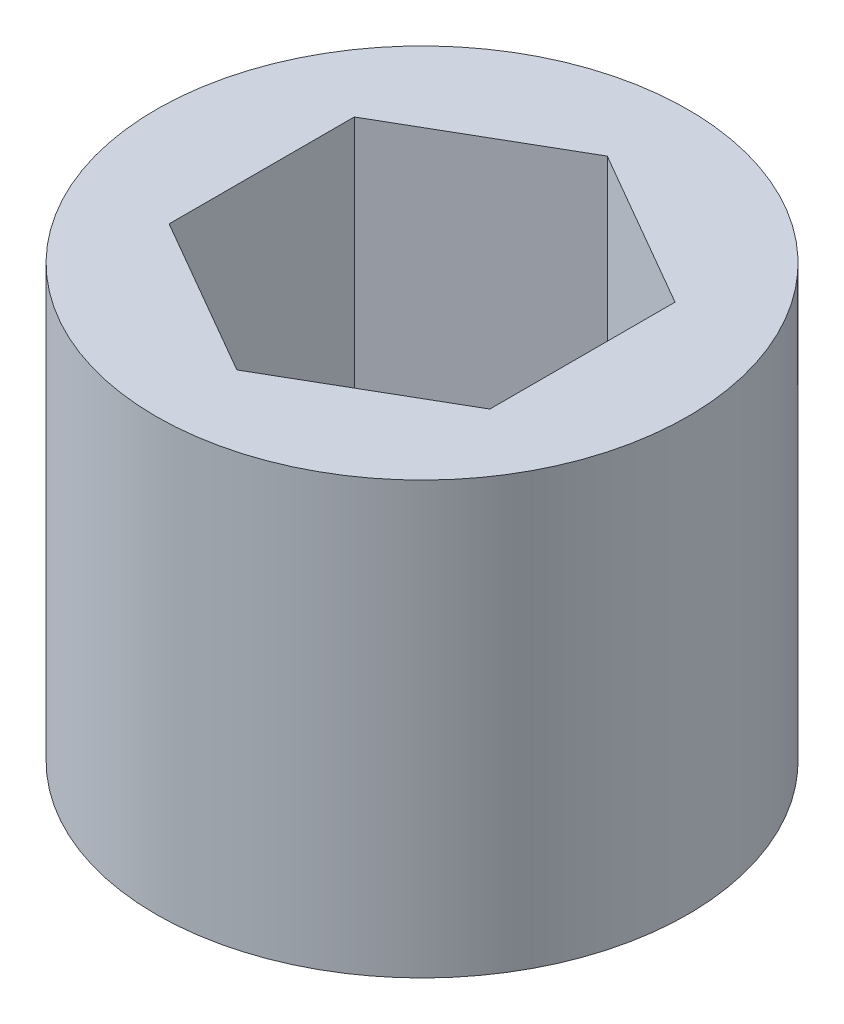
ISO-10303-21;
HEADER;
FILE_DESCRIPTION(('STEP AP214'),'2;1');
FILE_NAME('part.step','',(''),(''),'','','');
FILE_SCHEMA(('AUTOMOTIVE_DESIGN { 1 0 10303 214 1 1 1 1 }'));
ENDSEC;
DATA;
#1=APPLICATION_CONTEXT('core data for automotive mechanical design processes');
#2=APPLICATION_PROTOCOL_DEFINITION('international standard','automotive_design',2000,#1);
#3=PRODUCT_CONTEXT('',#1,'mechanical');
#4=PRODUCT('Part','Part','',(#3));
#5=PRODUCT_RELATED_PRODUCT_CATEGORY('part','',(#4));
#6=PRODUCT_DEFINITION_FORMATION('','',#4);
#7=PRODUCT_DEFINITION_CONTEXT('part definition',#1,'design');
#8=PRODUCT_DEFINITION('design','',#6,#7);
#9=PRODUCT_DEFINITION_SHAPE('','',#8);
#10=(LENGTH_UNIT() NAMED_UNIT(*) SI_UNIT(.MILLI.,.METRE.));
#11=(NAMED_UNIT(*) PLANE_ANGLE_UNIT() SI_UNIT($,.RADIAN.));
#12=(NAMED_UNIT(*) SI_UNIT($,.STERADIAN.) SOLID_ANGLE_UNIT());
#13=UNCERTAINTY_MEASURE_WITH_UNIT(LENGTH_MEASURE(1.E-05),#10,'distance_accuracy_value','');
#14=(GEOMETRIC_REPRESENTATION_CONTEXT(3) GLOBAL_UNCERTAINTY_ASSIGNED_CONTEXT((#13)) GLOBAL_UNIT_ASSIGNED_CONTEXT((#10,
#11,#12)) REPRESENTATION_CONTEXT('',''));
#15=CARTESIAN_POINT('',(0.,0.,0.));
#16=DIRECTION('',(0.,0.,1.));
#17=DIRECTION('',(1.,0.,0.));
#18=AXIS2_PLACEMENT_3D('',#15,#16,#17);
#19=CARTESIAN_POINT('',(0.,12.87272,0.));
#20=DIRECTION('',(0.,1.,0.));
#21=DIRECTION('',(0.,0.,1.));
#22=AXIS2_PLACEMENT_3D('',#19,#20,#21);
#23=PLANE('',#22);
#24=CARTESIAN_POINT('',(0.,12.87272,0.));
#25=DIRECTION('',(0.,1.,0.));
#26=DIRECTION('',(0.,0.,1.));
#27=AXIS2_PLACEMENT_3D('',#24,#25,#26);
#28=CIRCLE('',#27,7.9375);
#29=CARTESIAN_POINT('',(0.,12.87272,7.9375));
#30=VERTEX_POINT('',#29);
#31=EDGE_CURVE('E11',#30,#30,#28,.T.);
#32=ORIENTED_EDGE('',*,*,#31,.T.);
#33=EDGE_LOOP('',(#32));
#34=FACE_BOUND('',#33,.T.);
#35=DIRECTION('',(-0.866025403784439,0.,0.5));
#36=VECTOR('',#35,1.);
#37=CARTESIAN_POINT('',(0.,12.87272,-5.52859070770602));
#38=LINE('',#37,#36);
#39=CARTESIAN_POINT('',(0.,12.87272,-5.52859070770602));
#40=VERTEX_POINT('',#39);
#41=CARTESIAN_POINT('',(-4.7879,12.87272,-2.76429535385301));
#42=VERTEX_POINT('',#41);
#43=EDGE_CURVE('E97',#40,#42,#38,.T.);
#44=ORIENTED_EDGE('',*,*,#43,.F.);
#45=DIRECTION('',(-0.866025403784439,0.,-0.5));
#46=VECTOR('',#45,1.);
#47=CARTESIAN_POINT('',(4.7879,12.87272,-2.76429535385301));
#48=LINE('',#47,#46);
#49=CARTESIAN_POINT('',(4.7879,12.87272,-2.76429535385301));
#50=VERTEX_POINT('',#49);
#51=EDGE_CURVE('E89',#50,#40,#48,.T.);
#52=ORIENTED_EDGE('',*,*,#51,.F.);
#53=DIRECTION('',(0.,0.,-1.));
#54=VECTOR('',#53,1.);
#55=CARTESIAN_POINT('',(4.7879,12.87272,2.76429535385301));
#56=LINE('',#55,#54);
#57=CARTESIAN_POINT('',(4.7879,12.87272,2.76429535385301));
#58=VERTEX_POINT('',#57);
#59=EDGE_CURVE('E117',#58,#50,#56,.T.);
#60=ORIENTED_EDGE('',*,*,#59,.F.);
#61=DIRECTION('',(0.866025403784439,0.,-0.5));
#62=VECTOR('',#61,1.);
#63=CARTESIAN_POINT('',(0.,12.87272,5.52859070770602));
#64=LINE('',#63,#62);
#65=CARTESIAN_POINT('',(0.,12.87272,5.52859070770602));
#66=VERTEX_POINT('',#65);
#67=EDGE_CURVE('E115',#66,#58,#64,.T.);
#68=ORIENTED_EDGE('',*,*,#67,.F.);
#69=DIRECTION('',(0.866025403784439,0.,0.5));
#70=VECTOR('',#69,1.);
#71=CARTESIAN_POINT('',(-4.7879,12.87272,2.76429535385301));
#72=LINE('',#71,#70);
#73=CARTESIAN_POINT('',(-4.7879,12.87272,2.76429535385301));
#74=VERTEX_POINT('',#73);
#75=EDGE_CURVE('E111',#74,#66,#72,.T.);
#76=ORIENTED_EDGE('',*,*,#75,.F.);
#77=DIRECTION('',(0.,0.,1.));
#78=VECTOR('',#77,1.);
#79=CARTESIAN_POINT('',(-4.7879,12.87272,-2.76429535385301));
#80=LINE('',#79,#78);
#81=EDGE_CURVE('E109',#42,#74,#80,.T.);
#82=ORIENTED_EDGE('',*,*,#81,.F.);
#83=EDGE_LOOP('',(#44,#52,#60,#68,#76,#82));
#84=FACE_BOUND('',#83,.T.);
#85=ADVANCED_FACE('F36',(#34,#84),#23,.T.);
#86=CARTESIAN_POINT('',(0.,0.,0.));
#87=DIRECTION('',(0.,1.,0.));
#88=DIRECTION('',(0.,0.,1.));
#89=AXIS2_PLACEMENT_3D('',#86,#87,#88);
#90=PLANE('',#89);
#91=CARTESIAN_POINT('',(0.,0.,0.));
#92=DIRECTION('',(0.,1.,0.));
#93=DIRECTION('',(0.,0.,1.));
#94=AXIS2_PLACEMENT_3D('',#91,#92,#93);
#95=CIRCLE('',#94,7.9375);
#96=CARTESIAN_POINT('',(0.,0.,7.9375));
#97=VERTEX_POINT('',#96);
#98=EDGE_CURVE('E40',#97,#97,#95,.T.);
#99=ORIENTED_EDGE('',*,*,#98,.F.);
#100=EDGE_LOOP('',(#99));
#101=FACE_BOUND('',#100,.T.);
#102=DIRECTION('',(-0.866025403784439,0.,-0.5));
#103=VECTOR('',#102,1.);
#104=CARTESIAN_POINT('',(4.7879,0.,-2.76429535385301));
#105=LINE('',#104,#103);
#106=CARTESIAN_POINT('',(4.7879,0.,-2.76429535385301));
#107=VERTEX_POINT('',#106);
#108=CARTESIAN_POINT('',(0.,0.,-5.52859070770602));
#109=VERTEX_POINT('',#108);
#110=EDGE_CURVE('E59',#107,#109,#105,.T.);
#111=ORIENTED_EDGE('',*,*,#110,.T.);
#112=DIRECTION('',(-0.866025403784439,0.,0.5));
#113=VECTOR('',#112,1.);
#114=CARTESIAN_POINT('',(0.,0.,-5.52859070770602));
#115=LINE('',#114,#113);
#116=CARTESIAN_POINT('',(-4.7879,0.,-2.76429535385301));
#117=VERTEX_POINT('',#116);
#118=EDGE_CURVE('E104',#109,#117,#115,.T.);
#119=ORIENTED_EDGE('',*,*,#118,.T.);
#120=DIRECTION('',(0.,0.,1.));
#121=VECTOR('',#120,1.);
#122=CARTESIAN_POINT('',(-4.7879,0.,-2.76429535385301));
#123=LINE('',#122,#121);
#124=CARTESIAN_POINT('',(-4.7879,0.,2.76429535385301));
#125=VERTEX_POINT('',#124);
#126=EDGE_CURVE('E121',#117,#125,#123,.T.);
#127=ORIENTED_EDGE('',*,*,#126,.T.);
#128=DIRECTION('',(0.866025403784439,0.,0.5));
#129=VECTOR('',#128,1.);
#130=CARTESIAN_POINT('',(-4.7879,0.,2.76429535385301));
#131=LINE('',#130,#129);
#132=CARTESIAN_POINT('',(0.,0.,5.52859070770602));
#133=VERTEX_POINT('',#132);
#134=EDGE_CURVE('E124',#125,#133,#131,.T.);
#135=ORIENTED_EDGE('',*,*,#134,.T.);
#136=DIRECTION('',(0.866025403784439,0.,-0.5));
#137=VECTOR('',#136,1.);
#138=CARTESIAN_POINT('',(0.,0.,5.52859070770602));
#139=LINE('',#138,#137);
#140=CARTESIAN_POINT('',(4.7879,0.,2.76429535385301));
#141=VERTEX_POINT('',#140);
#142=EDGE_CURVE('E127',#133,#141,#139,.T.);
#143=ORIENTED_EDGE('',*,*,#142,.T.);
#144=DIRECTION('',(0.,0.,-1.));
#145=VECTOR('',#144,1.);
#146=CARTESIAN_POINT('',(4.7879,0.,2.76429535385301));
#147=LINE('',#146,#145);
#148=EDGE_CURVE('E98',#141,#107,#147,.T.);
#149=ORIENTED_EDGE('',*,*,#148,.T.);
#150=EDGE_LOOP('',(#111,#119,#127,#135,#143,#149));
#151=FACE_BOUND('',#150,.T.);
#152=ADVANCED_FACE('F144',(#101,#151),#90,.F.);
#153=CARTESIAN_POINT('',(0.,12.87272,0.));
#154=DIRECTION('',(0.,-1.,0.));
#155=DIRECTION('',(0.,0.,-1.));
#156=AXIS2_PLACEMENT_3D('',#153,#154,#155);
#157=CYLINDRICAL_SURFACE('',#156,7.9375);
#158=ORIENTED_EDGE('',*,*,#31,.F.);
#159=EDGE_LOOP('',(#158));
#160=FACE_BOUND('',#159,.T.);
#161=ORIENTED_EDGE('',*,*,#98,.T.);
#162=EDGE_LOOP('',(#161));
#163=FACE_BOUND('',#162,.T.);
#164=ADVANCED_FACE('F38',(#160,#163),#157,.T.);
#165=CARTESIAN_POINT('',(4.7879,12.87272,-2.76429535385301));
#166=DIRECTION('',(-0.5,0.,0.866025403784439));
#167=DIRECTION('',(0.866025403784439,0.,0.5));
#168=AXIS2_PLACEMENT_3D('',#165,#166,#167);
#169=PLANE('',#168);
#170=ORIENTED_EDGE('',*,*,#110,.F.);
#171=DIRECTION('',(0.,-1.,0.));
#172=VECTOR('',#171,1.);
#173=CARTESIAN_POINT('',(4.7879,12.87272,-2.76429535385301));
#174=LINE('',#173,#172);
#175=EDGE_CURVE('E93',#50,#107,#174,.T.);
#176=ORIENTED_EDGE('',*,*,#175,.F.);
#177=ORIENTED_EDGE('',*,*,#51,.T.);
#178=DIRECTION('',(0.,-1.,0.));
#179=VECTOR('',#178,1.);
#180=CARTESIAN_POINT('',(0.,12.87272,-5.52859070770602));
#181=LINE('',#180,#179);
#182=EDGE_CURVE('E92',#40,#109,#181,.T.);
#183=ORIENTED_EDGE('',*,*,#182,.T.);
#184=EDGE_LOOP('',(#170,#176,#177,#183));
#185=FACE_BOUND('',#184,.T.);
#186=ADVANCED_FACE('F91',(#185),#169,.T.);
#187=CARTESIAN_POINT('',(0.,12.87272,-5.52859070770602));
#188=DIRECTION('',(0.5,0.,0.866025403784439));
#189=DIRECTION('',(0.866025403784439,0.,-0.5));
#190=AXIS2_PLACEMENT_3D('',#187,#188,#189);
#191=PLANE('',#190);
#192=ORIENTED_EDGE('',*,*,#118,.F.);
#193=ORIENTED_EDGE('',*,*,#182,.F.);
#194=ORIENTED_EDGE('',*,*,#43,.T.);
#195=DIRECTION('',(0.,-1.,0.));
#196=VECTOR('',#195,1.);
#197=CARTESIAN_POINT('',(-4.7879,12.87272,-2.76429535385301));
#198=LINE('',#197,#196);
#199=EDGE_CURVE('E105',#42,#117,#198,.T.);
#200=ORIENTED_EDGE('',*,*,#199,.T.);
#201=EDGE_LOOP('',(#192,#193,#194,#200));
#202=FACE_BOUND('',#201,.T.);
#203=ADVANCED_FACE('F101',(#202),#191,.T.);
#204=CARTESIAN_POINT('',(-4.7879,12.87272,-2.76429535385301));
#205=DIRECTION('',(1.,0.,0.));
#206=DIRECTION('',(0.,0.,-1.));
#207=AXIS2_PLACEMENT_3D('',#204,#205,#206);
#208=PLANE('',#207);
#209=ORIENTED_EDGE('',*,*,#126,.F.);
#210=ORIENTED_EDGE('',*,*,#199,.F.);
#211=ORIENTED_EDGE('',*,*,#81,.T.);
#212=DIRECTION('',(0.,-1.,0.));
#213=VECTOR('',#212,1.);
#214=CARTESIAN_POINT('',(-4.7879,12.87272,2.76429535385301));
#215=LINE('',#214,#213);
#216=EDGE_CURVE('E136',#74,#125,#215,.T.);
#217=ORIENTED_EDGE('',*,*,#216,.T.);
#218=EDGE_LOOP('',(#209,#210,#211,#217));
#219=FACE_BOUND('',#218,.T.);
#220=ADVANCED_FACE('F140',(#219),#208,.T.);
#221=CARTESIAN_POINT('',(-4.7879,12.87272,2.76429535385301));
#222=DIRECTION('',(0.5,0.,-0.866025403784439));
#223=DIRECTION('',(-0.866025403784439,0.,-0.5));
#224=AXIS2_PLACEMENT_3D('',#221,#222,#223);
#225=PLANE('',#224);
#226=ORIENTED_EDGE('',*,*,#134,.F.);
#227=ORIENTED_EDGE('',*,*,#216,.F.);
#228=ORIENTED_EDGE('',*,*,#75,.T.);
#229=DIRECTION('',(0.,-1.,0.));
#230=VECTOR('',#229,1.);
#231=CARTESIAN_POINT('',(0.,12.87272,5.52859070770602));
#232=LINE('',#231,#230);
#233=EDGE_CURVE('E134',#66,#133,#232,.T.);
#234=ORIENTED_EDGE('',*,*,#233,.T.);
#235=EDGE_LOOP('',(#226,#227,#228,#234));
#236=FACE_BOUND('',#235,.T.);
#237=ADVANCED_FACE('F152',(#236),#225,.T.);
#238=CARTESIAN_POINT('',(0.,12.87272,5.52859070770602));
#239=DIRECTION('',(-0.5,0.,-0.866025403784439));
#240=DIRECTION('',(-0.866025403784439,0.,0.5));
#241=AXIS2_PLACEMENT_3D('',#238,#239,#240);
#242=PLANE('',#241);
#243=ORIENTED_EDGE('',*,*,#142,.F.);
#244=ORIENTED_EDGE('',*,*,#233,.F.);
#245=ORIENTED_EDGE('',*,*,#67,.T.);
#246=DIRECTION('',(0.,-1.,0.));
#247=VECTOR('',#246,1.);
#248=CARTESIAN_POINT('',(4.7879,12.87272,2.76429535385301));
#249=LINE('',#248,#247);
#250=EDGE_CURVE('E51',#58,#141,#249,.T.);
#251=ORIENTED_EDGE('',*,*,#250,.T.);
#252=EDGE_LOOP('',(#243,#244,#245,#251));
#253=FACE_BOUND('',#252,.T.);
#254=ADVANCED_FACE('F150',(#253),#242,.T.);
#255=CARTESIAN_POINT('',(4.7879,12.87272,2.76429535385301));
#256=DIRECTION('',(-1.,0.,0.));
#257=DIRECTION('',(0.,0.,1.));
#258=AXIS2_PLACEMENT_3D('',#255,#256,#257);
#259=PLANE('',#258);
#260=ORIENTED_EDGE('',*,*,#148,.F.);
#261=ORIENTED_EDGE('',*,*,#250,.F.);
#262=ORIENTED_EDGE('',*,*,#59,.T.);
#263=ORIENTED_EDGE('',*,*,#175,.T.);
#264=EDGE_LOOP('',(#260,#261,#262,#263));
#265=FACE_BOUND('',#264,.T.);
#266=ADVANCED_FACE('F146',(#265),#259,.T.);
#267=CLOSED_SHELL('',(#85,#152,#164,#186,#203,#220,#237,#254,#266));
#268=MANIFOLD_SOLID_BREP('B2',#267);
#269=ADVANCED_BREP_SHAPE_REPRESENTATION('',(#18,#268),#14);
#270=SHAPE_DEFINITION_REPRESENTATION(#9,#269);
ENDSEC;
END-ISO-10303-21;
